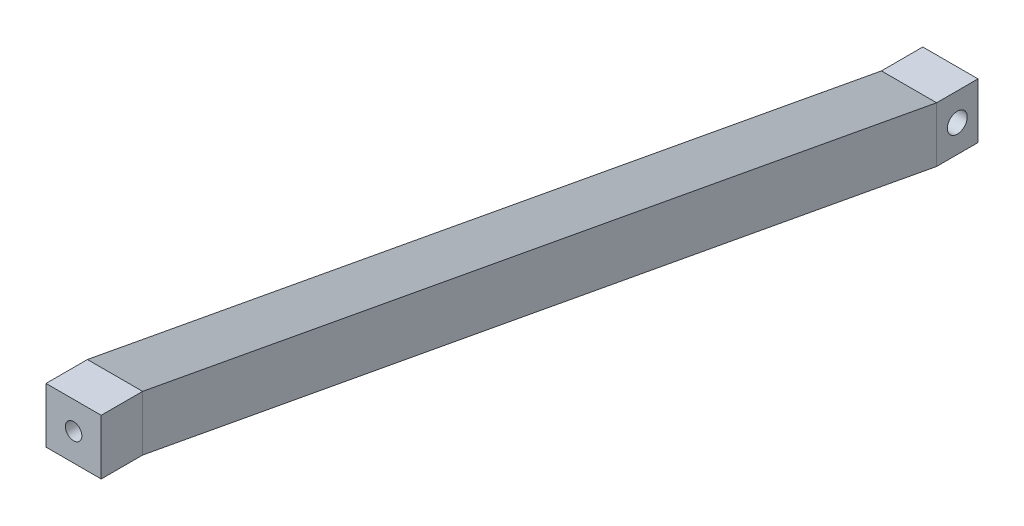
ISO-10303-21;
HEADER;
FILE_DESCRIPTION(('STEP AP214'),'2;1');
FILE_NAME('part.step','',(''),(''),'','','');
FILE_SCHEMA(('AUTOMOTIVE_DESIGN { 1 0 10303 214 1 1 1 1 }'));
ENDSEC;
DATA;
#1=APPLICATION_CONTEXT('core data for automotive mechanical design processes');
#2=APPLICATION_PROTOCOL_DEFINITION('international standard','automotive_design',2000,#1);
#3=PRODUCT_CONTEXT('',#1,'mechanical');
#4=PRODUCT('Part','Part','',(#3));
#5=PRODUCT_RELATED_PRODUCT_CATEGORY('part','',(#4));
#6=PRODUCT_DEFINITION_FORMATION('','',#4);
#7=PRODUCT_DEFINITION_CONTEXT('part definition',#1,'design');
#8=PRODUCT_DEFINITION('design','',#6,#7);
#9=PRODUCT_DEFINITION_SHAPE('','',#8);
#10=(LENGTH_UNIT() NAMED_UNIT(*) SI_UNIT(.MILLI.,.METRE.));
#11=(NAMED_UNIT(*) PLANE_ANGLE_UNIT() SI_UNIT($,.RADIAN.));
#12=(NAMED_UNIT(*) SI_UNIT($,.STERADIAN.) SOLID_ANGLE_UNIT());
#13=UNCERTAINTY_MEASURE_WITH_UNIT(LENGTH_MEASURE(1.E-05),#10,'distance_accuracy_value','');
#14=(GEOMETRIC_REPRESENTATION_CONTEXT(3) GLOBAL_UNCERTAINTY_ASSIGNED_CONTEXT((#13)) GLOBAL_UNIT_ASSIGNED_CONTEXT((#10,
#11,#12)) REPRESENTATION_CONTEXT('',''));
#15=CARTESIAN_POINT('',(0.,0.,0.));
#16=DIRECTION('',(0.,0.,1.));
#17=DIRECTION('',(1.,0.,0.));
#18=AXIS2_PLACEMENT_3D('',#15,#16,#17);
#19=CARTESIAN_POINT('',(0.,-5.56631989618918,2.08859142823333));
#20=DIRECTION('',(0.,0.936261614306329,-0.351303557591588));
#21=DIRECTION('',(0.,-0.351303557591588,-0.936261614306329));
#22=AXIS2_PLACEMENT_3D('',#19,#20,#21);
#23=PLANE('',#22);
#24=DIRECTION('',(-0.213324138298652,-0.343217069581253,-0.914710257495342));
#25=VECTOR('',#24,1.);
#26=CARTESIAN_POINT('',(6.35,-6.35,0.));
#27=LINE('',#26,#25);
#28=CARTESIAN_POINT('',(6.35,-6.35,0.));
#29=VERTEX_POINT('',#28);
#30=CARTESIAN_POINT('',(-49.2125,-95.74447069,-238.245840754));
#31=VERTEX_POINT('',#30);
#32=EDGE_CURVE('E356',#29,#31,#27,.T.);
#33=ORIENTED_EDGE('',*,*,#32,.F.);
#34=CARTESIAN_POINT('',(-6.35,-6.35,0.));
#35=DIRECTION('',(1.,0.,0.));
#36=VECTOR('',#35,1.);
#37=LINE('',#34,#36);
#38=CARTESIAN_POINT('',(-6.35,-6.35,0.));
#39=VERTEX_POINT('',#38);
#40=EDGE_CURVE('E367',#39,#29,#37,.T.);
#41=ORIENTED_EDGE('',*,*,#40,.F.);
#42=DIRECTION('',(-0.213324138298652,-0.343217069581253,-0.914710257495342));
#43=VECTOR('',#42,1.);
#44=CARTESIAN_POINT('',(-6.35,-6.35,0.));
#45=LINE('',#44,#43);
#46=CARTESIAN_POINT('',(-61.9125,-95.74447069,-238.245840754));
#47=VERTEX_POINT('',#46);
#48=EDGE_CURVE('E169',#39,#47,#45,.T.);
#49=ORIENTED_EDGE('',*,*,#48,.T.);
#50=CARTESIAN_POINT('',(-61.9125,-95.74447069,-238.245840754));
#51=DIRECTION('',(1.,0.,0.));
#52=VECTOR('',#51,1.);
#53=LINE('',#50,#52);
#54=EDGE_CURVE('E11',#47,#31,#53,.T.);
#55=ORIENTED_EDGE('',*,*,#54,.T.);
#56=EDGE_LOOP('',(#33,#41,#49,#55));
#57=FACE_BOUND('',#56,.T.);
#58=ADVANCED_FACE('F43',(#57),#23,.F.);
#59=CARTESIAN_POINT('',(-6.02244391925538,0.,1.40452416379911));
#60=DIRECTION('',(0.973866708146996,0.,-0.227120309005894));
#61=DIRECTION('',(0.227120309005894,0.,0.973866708146996));
#62=AXIS2_PLACEMENT_3D('',#59,#60,#61);
#63=PLANE('',#62);
#64=ORIENTED_EDGE('',*,*,#48,.F.);
#65=CARTESIAN_POINT('',(-6.35,6.35,0.));
#66=DIRECTION('',(0.,-1.,0.));
#67=VECTOR('',#66,1.);
#68=LINE('',#65,#67);
#69=CARTESIAN_POINT('',(-6.35,6.35,0.));
#70=VERTEX_POINT('',#69);
#71=EDGE_CURVE('E182',#70,#39,#68,.T.);
#72=ORIENTED_EDGE('',*,*,#71,.F.);
#73=DIRECTION('',(-0.213324138298652,-0.343217069581253,-0.914710257495342));
#74=VECTOR('',#73,1.);
#75=CARTESIAN_POINT('',(-6.35,6.35,0.));
#76=LINE('',#75,#74);
#77=CARTESIAN_POINT('',(-61.9125,-83.04447069,-238.245840754));
#78=VERTEX_POINT('',#77);
#79=EDGE_CURVE('E168',#70,#78,#76,.T.);
#80=ORIENTED_EDGE('',*,*,#79,.T.);
#81=CARTESIAN_POINT('',(-61.9125,-83.04447069,-238.245840754));
#82=DIRECTION('',(0.,-1.,0.));
#83=VECTOR('',#82,1.);
#84=LINE('',#81,#83);
#85=EDGE_CURVE('E174',#78,#47,#84,.T.);
#86=ORIENTED_EDGE('',*,*,#85,.T.);
#87=EDGE_LOOP('',(#64,#72,#80,#86));
#88=FACE_BOUND('',#87,.T.);
#89=ADVANCED_FACE('F188',(#88),#63,.F.);
#90=CARTESIAN_POINT('',(6.02244391925537,0.,-1.4045241637991));
#91=DIRECTION('',(-0.973866708146996,0.,0.227120309005894));
#92=DIRECTION('',(-0.227120309005894,0.,-0.973866708146996));
#93=AXIS2_PLACEMENT_3D('',#90,#91,#92);
#94=PLANE('',#93);
#95=DIRECTION('',(-0.213324138298652,-0.343217069581253,-0.914710257495342));
#96=VECTOR('',#95,1.);
#97=CARTESIAN_POINT('',(6.35,6.35,0.));
#98=LINE('',#97,#96);
#99=CARTESIAN_POINT('',(6.35,6.35,0.));
#100=VERTEX_POINT('',#99);
#101=CARTESIAN_POINT('',(-49.2125,-83.04447069,-238.245840754));
#102=VERTEX_POINT('',#101);
#103=EDGE_CURVE('E161',#100,#102,#98,.T.);
#104=ORIENTED_EDGE('',*,*,#103,.F.);
#105=CARTESIAN_POINT('',(6.35,-6.34999999999999,0.));
#106=DIRECTION('',(0.,1.,0.));
#107=VECTOR('',#106,1.);
#108=LINE('',#105,#107);
#109=EDGE_CURVE('E352',#29,#100,#108,.T.);
#110=ORIENTED_EDGE('',*,*,#109,.F.);
#111=ORIENTED_EDGE('',*,*,#32,.T.);
#112=CARTESIAN_POINT('',(-49.2125,-95.74447069,-238.245840754));
#113=DIRECTION('',(0.,1.,0.));
#114=VECTOR('',#113,1.);
#115=LINE('',#112,#114);
#116=EDGE_CURVE('E55',#31,#102,#115,.T.);
#117=ORIENTED_EDGE('',*,*,#116,.T.);
#118=EDGE_LOOP('',(#104,#110,#111,#117));
#119=FACE_BOUND('',#118,.T.);
#120=ADVANCED_FACE('F197',(#119),#94,.F.);
#121=CARTESIAN_POINT('',(0.,5.56631989618919,-2.08859142823334));
#122=DIRECTION('',(0.,-0.936261614306329,0.351303557591588));
#123=DIRECTION('',(0.,0.351303557591588,0.936261614306329));
#124=AXIS2_PLACEMENT_3D('',#121,#122,#123);
#125=PLANE('',#124);
#126=ORIENTED_EDGE('',*,*,#79,.F.);
#127=CARTESIAN_POINT('',(6.35,6.35,0.));
#128=DIRECTION('',(-1.,0.,0.));
#129=VECTOR('',#128,1.);
#130=LINE('',#127,#129);
#131=EDGE_CURVE('E156',#100,#70,#130,.T.);
#132=ORIENTED_EDGE('',*,*,#131,.F.);
#133=ORIENTED_EDGE('',*,*,#103,.T.);
#134=CARTESIAN_POINT('',(-49.2125,-83.04447069,-238.245840754));
#135=DIRECTION('',(-1.,0.,0.));
#136=VECTOR('',#135,1.);
#137=LINE('',#134,#136);
#138=EDGE_CURVE('E264',#102,#78,#137,.T.);
#139=ORIENTED_EDGE('',*,*,#138,.T.);
#140=EDGE_LOOP('',(#126,#132,#133,#139));
#141=FACE_BOUND('',#140,.T.);
#142=ADVANCED_FACE('F45',(#141),#125,.F.);
#143=CARTESIAN_POINT('',(6.35,6.35,9.525));
#144=DIRECTION('',(-1.,0.,0.));
#145=DIRECTION('',(0.,0.,-1.));
#146=AXIS2_PLACEMENT_3D('',#143,#144,#145);
#147=PLANE('',#146);
#148=ORIENTED_EDGE('',*,*,#109,.T.);
#149=DIRECTION('',(0.,0.,-1.));
#150=VECTOR('',#149,1.);
#151=CARTESIAN_POINT('',(6.35,6.35,9.525));
#152=LINE('',#151,#150);
#153=CARTESIAN_POINT('',(6.35,6.35,9.525));
#154=VERTEX_POINT('',#153);
#155=EDGE_CURVE('E149',#154,#100,#152,.T.);
#156=ORIENTED_EDGE('',*,*,#155,.F.);
#157=DIRECTION('',(0.,-1.,0.));
#158=VECTOR('',#157,1.);
#159=CARTESIAN_POINT('',(6.35,6.35,9.525));
#160=LINE('',#159,#158);
#161=CARTESIAN_POINT('',(6.35,-6.35,9.525));
#162=VERTEX_POINT('',#161);
#163=EDGE_CURVE('E125',#154,#162,#160,.T.);
#164=ORIENTED_EDGE('',*,*,#163,.T.);
#165=DIRECTION('',(0.,0.,-1.));
#166=VECTOR('',#165,1.);
#167=CARTESIAN_POINT('',(6.35,-6.35,9.525));
#168=LINE('',#167,#166);
#169=EDGE_CURVE('E372',#162,#29,#168,.T.);
#170=ORIENTED_EDGE('',*,*,#169,.T.);
#171=EDGE_LOOP('',(#148,#156,#164,#170));
#172=FACE_BOUND('',#171,.T.);
#173=ADVANCED_FACE('F392',(#172),#147,.F.);
#174=CARTESIAN_POINT('',(6.35,-6.35,9.525));
#175=DIRECTION('',(0.,1.,0.));
#176=DIRECTION('',(0.,0.,-1.));
#177=AXIS2_PLACEMENT_3D('',#174,#175,#176);
#178=PLANE('',#177);
#179=ORIENTED_EDGE('',*,*,#40,.T.);
#180=ORIENTED_EDGE('',*,*,#169,.F.);
#181=DIRECTION('',(-1.,0.,0.));
#182=VECTOR('',#181,1.);
#183=CARTESIAN_POINT('',(6.35,-6.35,9.525));
#184=LINE('',#183,#182);
#185=CARTESIAN_POINT('',(-6.35,-6.35,9.525));
#186=VERTEX_POINT('',#185);
#187=EDGE_CURVE('E141',#162,#186,#184,.T.);
#188=ORIENTED_EDGE('',*,*,#187,.T.);
#189=DIRECTION('',(0.,0.,-1.));
#190=VECTOR('',#189,1.);
#191=CARTESIAN_POINT('',(-6.35,-6.35,9.525));
#192=LINE('',#191,#190);
#193=EDGE_CURVE('E215',#186,#39,#192,.T.);
#194=ORIENTED_EDGE('',*,*,#193,.T.);
#195=EDGE_LOOP('',(#179,#180,#188,#194));
#196=FACE_BOUND('',#195,.T.);
#197=ADVANCED_FACE('F241',(#196),#178,.F.);
#198=CARTESIAN_POINT('',(-6.35,6.35,9.525));
#199=DIRECTION('',(1.,0.,0.));
#200=DIRECTION('',(0.,0.,1.));
#201=AXIS2_PLACEMENT_3D('',#198,#199,#200);
#202=PLANE('',#201);
#203=ORIENTED_EDGE('',*,*,#71,.T.);
#204=ORIENTED_EDGE('',*,*,#193,.F.);
#205=DIRECTION('',(0.,1.,0.));
#206=VECTOR('',#205,1.);
#207=CARTESIAN_POINT('',(-6.35,6.35,9.525));
#208=LINE('',#207,#206);
#209=CARTESIAN_POINT('',(-6.35,6.35,9.525));
#210=VERTEX_POINT('',#209);
#211=EDGE_CURVE('E144',#186,#210,#208,.T.);
#212=ORIENTED_EDGE('',*,*,#211,.T.);
#213=DIRECTION('',(0.,0.,-1.));
#214=VECTOR('',#213,1.);
#215=CARTESIAN_POINT('',(-6.35,6.35,9.525));
#216=LINE('',#215,#214);
#217=EDGE_CURVE('E208',#210,#70,#216,.T.);
#218=ORIENTED_EDGE('',*,*,#217,.T.);
#219=EDGE_LOOP('',(#203,#204,#212,#218));
#220=FACE_BOUND('',#219,.T.);
#221=ADVANCED_FACE('F237',(#220),#202,.F.);
#222=CARTESIAN_POINT('',(6.35,6.35,9.525));
#223=DIRECTION('',(0.,-1.,0.));
#224=DIRECTION('',(0.,0.,1.));
#225=AXIS2_PLACEMENT_3D('',#222,#223,#224);
#226=PLANE('',#225);
#227=ORIENTED_EDGE('',*,*,#131,.T.);
#228=ORIENTED_EDGE('',*,*,#217,.F.);
#229=DIRECTION('',(1.,0.,0.));
#230=VECTOR('',#229,1.);
#231=CARTESIAN_POINT('',(6.35,6.35,9.525));
#232=LINE('',#231,#230);
#233=EDGE_CURVE('E147',#210,#154,#232,.T.);
#234=ORIENTED_EDGE('',*,*,#233,.T.);
#235=ORIENTED_EDGE('',*,*,#155,.T.);
#236=EDGE_LOOP('',(#227,#228,#234,#235));
#237=FACE_BOUND('',#236,.T.);
#238=ADVANCED_FACE('F226',(#237),#226,.F.);
#239=CARTESIAN_POINT('',(0.,0.,9.525));
#240=DIRECTION('',(0.,0.,1.));
#241=DIRECTION('',(-1.,0.,0.));
#242=AXIS2_PLACEMENT_3D('',#239,#240,#241);
#243=PLANE('',#242);
#244=CARTESIAN_POINT('',(0.,0.,9.525));
#245=DIRECTION('',(0.,0.,-1.));
#246=DIRECTION('',(-1.,0.,0.));
#247=AXIS2_PLACEMENT_3D('',#244,#245,#246);
#248=CIRCLE('',#247,1.905);
#249=CARTESIAN_POINT('',(-1.905,0.,9.525));
#250=VERTEX_POINT('',#249);
#251=EDGE_CURVE('E523',#250,#250,#248,.T.);
#252=ORIENTED_EDGE('',*,*,#251,.T.);
#253=EDGE_LOOP('',(#252));
#254=FACE_BOUND('',#253,.T.);
#255=ORIENTED_EDGE('',*,*,#163,.F.);
#256=ORIENTED_EDGE('',*,*,#233,.F.);
#257=ORIENTED_EDGE('',*,*,#211,.F.);
#258=ORIENTED_EDGE('',*,*,#187,.F.);
#259=EDGE_LOOP('',(#255,#256,#257,#258));
#260=FACE_BOUND('',#259,.T.);
#261=ADVANCED_FACE('F236',(#254,#260),#243,.T.);
#262=CARTESIAN_POINT('',(-61.9125,-83.04447069,-247.770840754));
#263=DIRECTION('',(1.,0.,0.));
#264=DIRECTION('',(0.,0.,1.));
#265=AXIS2_PLACEMENT_3D('',#262,#263,#264);
#266=PLANE('',#265);
#267=CARTESIAN_POINT('',(-61.9125,-89.39447069,-243.008340754));
#268=DIRECTION('',(-1.,0.,0.));
#269=DIRECTION('',(0.,0.,1.));
#270=AXIS2_PLACEMENT_3D('',#267,#268,#269);
#271=CIRCLE('',#270,2.28600000000004);
#272=CARTESIAN_POINT('',(-61.9125,-89.39447069,-240.722340754));
#273=VERTEX_POINT('',#272);
#274=EDGE_CURVE('E129',#273,#273,#271,.T.);
#275=ORIENTED_EDGE('',*,*,#274,.F.);
#276=EDGE_LOOP('',(#275));
#277=FACE_BOUND('',#276,.T.);
#278=ORIENTED_EDGE('',*,*,#85,.F.);
#279=DIRECTION('',(0.,0.,1.));
#280=VECTOR('',#279,1.);
#281=CARTESIAN_POINT('',(-61.9125,-83.04447069,-247.770840754));
#282=LINE('',#281,#280);
#283=CARTESIAN_POINT('',(-61.9125,-83.04447069,-247.770840754));
#284=VERTEX_POINT('',#283);
#285=EDGE_CURVE('E128',#284,#78,#282,.T.);
#286=ORIENTED_EDGE('',*,*,#285,.F.);
#287=DIRECTION('',(0.,-1.,0.));
#288=VECTOR('',#287,1.);
#289=CARTESIAN_POINT('',(-61.9125,-83.04447069,-247.770840754));
#290=LINE('',#289,#288);
#291=CARTESIAN_POINT('',(-61.9125,-95.74447069,-247.770840754));
#292=VERTEX_POINT('',#291);
#293=EDGE_CURVE('E117',#284,#292,#290,.T.);
#294=ORIENTED_EDGE('',*,*,#293,.T.);
#295=DIRECTION('',(0.,0.,1.));
#296=VECTOR('',#295,1.);
#297=CARTESIAN_POINT('',(-61.9125,-95.74447069,-247.770840754));
#298=LINE('',#297,#296);
#299=EDGE_CURVE('E62',#292,#47,#298,.T.);
#300=ORIENTED_EDGE('',*,*,#299,.T.);
#301=EDGE_LOOP('',(#278,#286,#294,#300));
#302=FACE_BOUND('',#301,.T.);
#303=ADVANCED_FACE('F127',(#277,#302),#266,.F.);
#304=CARTESIAN_POINT('',(-61.9125,-95.74447069,-247.770840754));
#305=DIRECTION('',(0.,1.,0.));
#306=DIRECTION('',(0.,0.,-1.));
#307=AXIS2_PLACEMENT_3D('',#304,#305,#306);
#308=PLANE('',#307);
#309=ORIENTED_EDGE('',*,*,#54,.F.);
#310=ORIENTED_EDGE('',*,*,#299,.F.);
#311=DIRECTION('',(1.,0.,0.));
#312=VECTOR('',#311,1.);
#313=CARTESIAN_POINT('',(-61.9125,-95.74447069,-247.770840754));
#314=LINE('',#313,#312);
#315=CARTESIAN_POINT('',(-49.2125,-95.74447069,-247.770840754));
#316=VERTEX_POINT('',#315);
#317=EDGE_CURVE('E115',#292,#316,#314,.T.);
#318=ORIENTED_EDGE('',*,*,#317,.T.);
#319=DIRECTION('',(0.,0.,1.));
#320=VECTOR('',#319,1.);
#321=CARTESIAN_POINT('',(-49.2125,-95.74447069,-247.770840754));
#322=LINE('',#321,#320);
#323=EDGE_CURVE('E70',#316,#31,#322,.T.);
#324=ORIENTED_EDGE('',*,*,#323,.T.);
#325=EDGE_LOOP('',(#309,#310,#318,#324));
#326=FACE_BOUND('',#325,.T.);
#327=ADVANCED_FACE('F122',(#326),#308,.F.);
#328=CARTESIAN_POINT('',(-49.2125,-83.04447069,-247.770840754));
#329=DIRECTION('',(-1.,0.,0.));
#330=DIRECTION('',(0.,-1.,0.));
#331=AXIS2_PLACEMENT_3D('',#328,#329,#330);
#332=PLANE('',#331);
#333=CARTESIAN_POINT('',(-49.2124999999999,-89.39447069,-243.008340754));
#334=DIRECTION('',(-1.,0.,0.));
#335=DIRECTION('',(0.,1.,0.));
#336=AXIS2_PLACEMENT_3D('',#333,#334,#335);
#337=CIRCLE('',#336,2.28600000000004);
#338=CARTESIAN_POINT('',(-49.2124999999999,-87.10847069,-243.008340754));
#339=VERTEX_POINT('',#338);
#340=EDGE_CURVE('E132',#339,#339,#337,.T.);
#341=ORIENTED_EDGE('',*,*,#340,.T.);
#342=EDGE_LOOP('',(#341));
#343=FACE_BOUND('',#342,.T.);
#344=ORIENTED_EDGE('',*,*,#116,.F.);
#345=ORIENTED_EDGE('',*,*,#323,.F.);
#346=DIRECTION('',(0.,1.,0.));
#347=VECTOR('',#346,1.);
#348=CARTESIAN_POINT('',(-49.2125,-83.04447069,-247.770840754));
#349=LINE('',#348,#347);
#350=CARTESIAN_POINT('',(-49.2125,-83.04447069,-247.770840754));
#351=VERTEX_POINT('',#350);
#352=EDGE_CURVE('E120',#316,#351,#349,.T.);
#353=ORIENTED_EDGE('',*,*,#352,.T.);
#354=DIRECTION('',(0.,0.,1.));
#355=VECTOR('',#354,1.);
#356=CARTESIAN_POINT('',(-49.2125,-83.04447069,-247.770840754));
#357=LINE('',#356,#355);
#358=EDGE_CURVE('E256',#351,#102,#357,.T.);
#359=ORIENTED_EDGE('',*,*,#358,.T.);
#360=EDGE_LOOP('',(#344,#345,#353,#359));
#361=FACE_BOUND('',#360,.T.);
#362=ADVANCED_FACE('F281',(#343,#361),#332,.F.);
#363=CARTESIAN_POINT('',(-61.9125,-83.04447069,-247.770840754));
#364=DIRECTION('',(0.,-1.,0.));
#365=DIRECTION('',(0.,0.,1.));
#366=AXIS2_PLACEMENT_3D('',#363,#364,#365);
#367=PLANE('',#366);
#368=ORIENTED_EDGE('',*,*,#138,.F.);
#369=ORIENTED_EDGE('',*,*,#358,.F.);
#370=DIRECTION('',(-1.,0.,0.));
#371=VECTOR('',#370,1.);
#372=CARTESIAN_POINT('',(-61.9125,-83.04447069,-247.770840754));
#373=LINE('',#372,#371);
#374=EDGE_CURVE('E137',#351,#284,#373,.T.);
#375=ORIENTED_EDGE('',*,*,#374,.T.);
#376=ORIENTED_EDGE('',*,*,#285,.T.);
#377=EDGE_LOOP('',(#368,#369,#375,#376));
#378=FACE_BOUND('',#377,.T.);
#379=ADVANCED_FACE('F271',(#378),#367,.F.);
#380=CARTESIAN_POINT('',(0.,0.,-247.770840754));
#381=DIRECTION('',(0.,0.,-1.));
#382=DIRECTION('',(1.,0.,0.));
#383=AXIS2_PLACEMENT_3D('',#380,#381,#382);
#384=PLANE('',#383);
#385=ORIENTED_EDGE('',*,*,#293,.F.);
#386=ORIENTED_EDGE('',*,*,#374,.F.);
#387=ORIENTED_EDGE('',*,*,#352,.F.);
#388=ORIENTED_EDGE('',*,*,#317,.F.);
#389=EDGE_LOOP('',(#385,#386,#387,#388));
#390=FACE_BOUND('',#389,.T.);
#391=ADVANCED_FACE('F116',(#390),#384,.T.);
#392=CARTESIAN_POINT('',(-61.9126,-89.39447069,-243.008340754));
#393=DIRECTION('',(1.,0.,0.));
#394=DIRECTION('',(0.,1.,0.));
#395=AXIS2_PLACEMENT_3D('',#392,#393,#394);
#396=CYLINDRICAL_SURFACE('',#395,2.28600000000004);
#397=ORIENTED_EDGE('',*,*,#340,.F.);
#398=EDGE_LOOP('',(#397));
#399=FACE_BOUND('',#398,.T.);
#400=ORIENTED_EDGE('',*,*,#274,.T.);
#401=EDGE_LOOP('',(#400));
#402=FACE_BOUND('',#401,.T.);
#403=ADVANCED_FACE('F490',(#399,#402),#396,.F.);
#404=CARTESIAN_POINT('',(0.,0.,-3.175));
#405=DIRECTION('',(0.,0.,1.));
#406=DIRECTION('',(-1.,0.,0.));
#407=AXIS2_PLACEMENT_3D('',#404,#405,#406);
#408=CYLINDRICAL_SURFACE('',#407,1.905);
#409=CARTESIAN_POINT('',(0.,0.,-3.175));
#410=DIRECTION('',(0.,0.,-1.));
#411=DIRECTION('',(-1.,0.,0.));
#412=AXIS2_PLACEMENT_3D('',#409,#410,#411);
#413=CIRCLE('',#412,1.905);
#414=CARTESIAN_POINT('',(-1.905,0.,-3.175));
#415=VERTEX_POINT('',#414);
#416=EDGE_CURVE('E522',#415,#415,#413,.T.);
#417=ORIENTED_EDGE('',*,*,#416,.T.);
#418=EDGE_LOOP('',(#417));
#419=FACE_BOUND('',#418,.T.);
#420=ORIENTED_EDGE('',*,*,#251,.F.);
#421=EDGE_LOOP('',(#420));
#422=FACE_BOUND('',#421,.T.);
#423=ADVANCED_FACE('F498',(#419,#422),#408,.F.);
#424=CARTESIAN_POINT('',(0.,0.,-3.175));
#425=DIRECTION('',(0.,0.,1.));
#426=DIRECTION('',(-1.,0.,0.));
#427=AXIS2_PLACEMENT_3D('',#424,#425,#426);
#428=PLANE('',#427);
#429=ORIENTED_EDGE('',*,*,#416,.F.);
#430=EDGE_LOOP('',(#429));
#431=FACE_BOUND('',#430,.T.);
#432=ADVANCED_FACE('F507',(#431),#428,.T.);
#433=CLOSED_SHELL('',(#58,#89,#120,#142,#173,#197,#221,#238,#261,#303,#327,#362,#379,#391,#403,
#423,#432));
#434=MANIFOLD_SOLID_BREP('B2',#433);
#435=ADVANCED_BREP_SHAPE_REPRESENTATION('',(#18,#434),#14);
#436=SHAPE_DEFINITION_REPRESENTATION(#9,#435);
ENDSEC;
END-ISO-10303-21;
